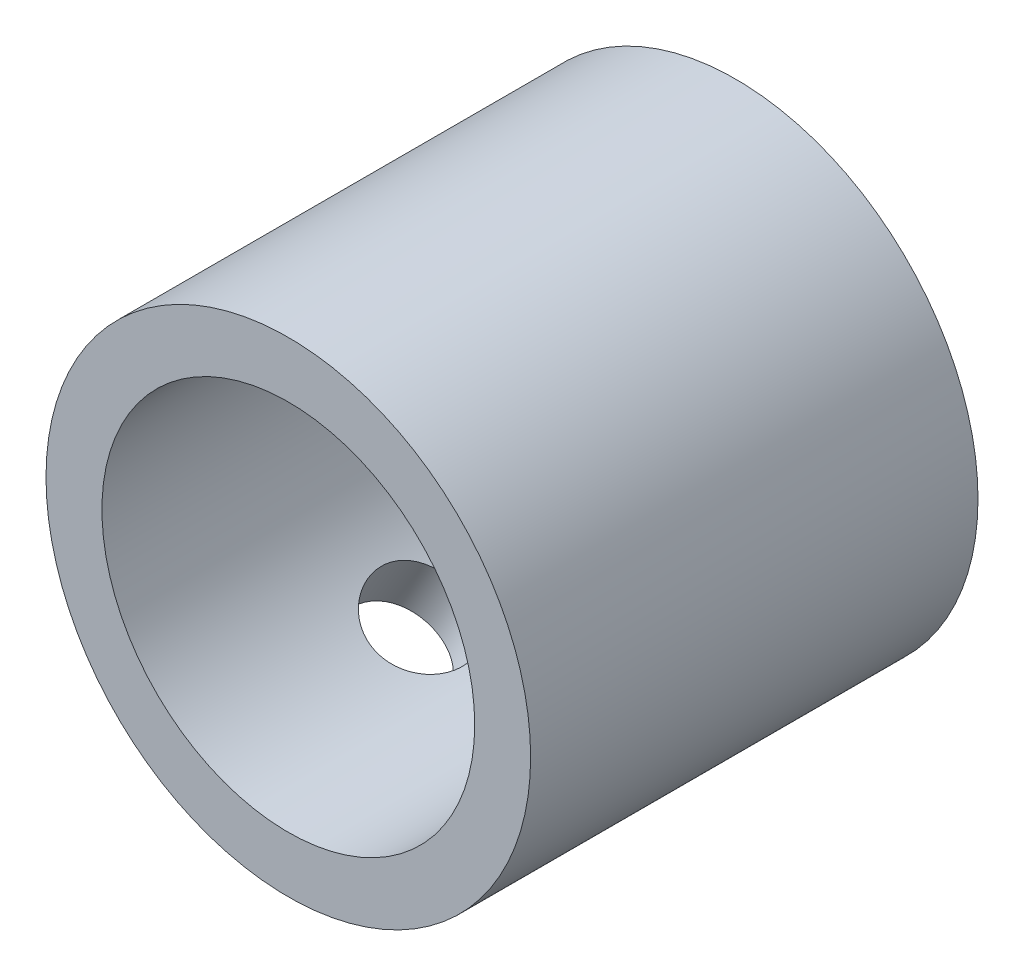
ISO-10303-21;
HEADER;
FILE_DESCRIPTION(('STEP AP214'),'2;1');
FILE_NAME('part.step','',(''),(''),'','','');
FILE_SCHEMA(('AUTOMOTIVE_DESIGN { 1 0 10303 214 1 1 1 1 }'));
ENDSEC;
DATA;
#1=APPLICATION_CONTEXT('core data for automotive mechanical design processes');
#2=APPLICATION_PROTOCOL_DEFINITION('international standard','automotive_design',2000,#1);
#3=PRODUCT_CONTEXT('',#1,'mechanical');
#4=PRODUCT('Part','Part','',(#3));
#5=PRODUCT_RELATED_PRODUCT_CATEGORY('part','',(#4));
#6=PRODUCT_DEFINITION_FORMATION('','',#4);
#7=PRODUCT_DEFINITION_CONTEXT('part definition',#1,'design');
#8=PRODUCT_DEFINITION('design','',#6,#7);
#9=PRODUCT_DEFINITION_SHAPE('','',#8);
#10=(LENGTH_UNIT() NAMED_UNIT(*) SI_UNIT(.MILLI.,.METRE.));
#11=(NAMED_UNIT(*) PLANE_ANGLE_UNIT() SI_UNIT($,.RADIAN.));
#12=(NAMED_UNIT(*) SI_UNIT($,.STERADIAN.) SOLID_ANGLE_UNIT());
#13=UNCERTAINTY_MEASURE_WITH_UNIT(LENGTH_MEASURE(1.E-05),#10,'distance_accuracy_value','');
#14=(GEOMETRIC_REPRESENTATION_CONTEXT(3) GLOBAL_UNCERTAINTY_ASSIGNED_CONTEXT((#13)) GLOBAL_UNIT_ASSIGNED_CONTEXT((#10,
#11,#12)) REPRESENTATION_CONTEXT('',''));
#15=CARTESIAN_POINT('',(0.,0.,0.));
#16=DIRECTION('',(0.,0.,1.));
#17=DIRECTION('',(1.,0.,0.));
#18=AXIS2_PLACEMENT_3D('',#15,#16,#17);
#19=CARTESIAN_POINT('',(0.,0.,6.));
#20=DIRECTION('',(0.,0.,1.));
#21=DIRECTION('',(1.,0.,0.));
#22=AXIS2_PLACEMENT_3D('',#19,#20,#21);
#23=PLANE('',#22);
#24=CARTESIAN_POINT('',(0.,0.,6.));
#25=DIRECTION('',(0.,0.,1.));
#26=DIRECTION('',(1.,0.,0.));
#27=AXIS2_PLACEMENT_3D('',#24,#25,#26);
#28=CIRCLE('',#27,6.5);
#29=CARTESIAN_POINT('',(6.5,0.,6.));
#30=VERTEX_POINT('',#29);
#31=EDGE_CURVE('E10',#30,#30,#28,.T.);
#32=ORIENTED_EDGE('',*,*,#31,.T.);
#33=EDGE_LOOP('',(#32));
#34=FACE_BOUND('',#33,.T.);
#35=CARTESIAN_POINT('',(0.,0.,6.));
#36=DIRECTION('',(0.,0.,1.));
#37=DIRECTION('',(1.,0.,0.));
#38=AXIS2_PLACEMENT_3D('',#35,#36,#37);
#39=CIRCLE('',#38,5.);
#40=CARTESIAN_POINT('',(5.,0.,6.));
#41=VERTEX_POINT('',#40);
#42=EDGE_CURVE('E58',#41,#41,#39,.T.);
#43=ORIENTED_EDGE('',*,*,#42,.F.);
#44=EDGE_LOOP('',(#43));
#45=FACE_BOUND('',#44,.T.);
#46=ADVANCED_FACE('F41',(#34,#45),#23,.T.);
#47=CARTESIAN_POINT('',(0.,0.,-6.));
#48=DIRECTION('',(0.,0.,1.));
#49=DIRECTION('',(1.,0.,0.));
#50=AXIS2_PLACEMENT_3D('',#47,#48,#49);
#51=PLANE('',#50);
#52=CARTESIAN_POINT('',(0.,0.,-6.));
#53=DIRECTION('',(0.,0.,1.));
#54=DIRECTION('',(1.,0.,0.));
#55=AXIS2_PLACEMENT_3D('',#52,#53,#54);
#56=CIRCLE('',#55,6.5);
#57=CARTESIAN_POINT('',(6.5,0.,-6.));
#58=VERTEX_POINT('',#57);
#59=EDGE_CURVE('E54',#58,#58,#56,.T.);
#60=ORIENTED_EDGE('',*,*,#59,.F.);
#61=EDGE_LOOP('',(#60));
#62=FACE_BOUND('',#61,.T.);
#63=CARTESIAN_POINT('',(0.,0.,-6.));
#64=DIRECTION('',(0.,0.,1.));
#65=DIRECTION('',(1.,0.,0.));
#66=AXIS2_PLACEMENT_3D('',#63,#64,#65);
#67=CIRCLE('',#66,5.);
#68=CARTESIAN_POINT('',(5.,0.,-6.));
#69=VERTEX_POINT('',#68);
#70=EDGE_CURVE('E65',#69,#69,#67,.T.);
#71=ORIENTED_EDGE('',*,*,#70,.T.);
#72=EDGE_LOOP('',(#71));
#73=FACE_BOUND('',#72,.T.);
#74=ADVANCED_FACE('F81',(#62,#73),#51,.F.);
#75=CARTESIAN_POINT('',(0.,0.,6.));
#76=DIRECTION('',(0.,0.,-1.));
#77=DIRECTION('',(-1.,0.,0.));
#78=AXIS2_PLACEMENT_3D('',#75,#76,#77);
#79=CYLINDRICAL_SURFACE('',#78,6.5);
#80=CARTESIAN_POINT('',(-4.27186946027382,-4.89909494849608,0.));
#81=CARTESIAN_POINT('',(-4.27186786234575,-4.89909744309064,0.0695129298701196));
#82=CARTESIAN_POINT('',(-4.26740512682392,-4.9029987715289,0.139059615060494));
#83=CARTESIAN_POINT('',(-4.24963701126369,-4.91840608002643,0.276189529414037));
#84=CARTESIAN_POINT('',(-4.23632429076359,-4.92991837282025,0.343771080023577));
#85=CARTESIAN_POINT('',(-4.2011402497674,-4.95993461568795,0.474966822381257));
#86=CARTESIAN_POINT('',(-4.17927710502217,-4.97843188628066,0.538584736914953));
#87=CARTESIAN_POINT('',(-4.12742162531229,-5.02150592376772,0.660186274966827));
#88=CARTESIAN_POINT('',(-4.09742985625947,-5.04608226742886,0.718170290333359));
#89=CARTESIAN_POINT('',(-4.02948728504461,-5.10050424792605,0.827620606218869));
#90=CARTESIAN_POINT('',(-3.99144724915814,-5.13040831263604,0.87900247475433));
#91=CARTESIAN_POINT('',(-3.90837101927236,-5.19397405762879,0.973053765073602));
#92=CARTESIAN_POINT('',(-3.86333435476041,-5.2276359905796,1.01572260047221));
#93=CARTESIAN_POINT('',(-3.76681408584738,-5.29761150827754,1.09146170512889));
#94=CARTESIAN_POINT('',(-3.71528160693785,-5.33394421877233,1.12445212935253));
#95=CARTESIAN_POINT('',(-3.60725951597228,-5.40758227913953,1.17938321266358));
#96=CARTESIAN_POINT('',(-3.55077033320674,-5.44488754458453,1.20132482755992));
#97=CARTESIAN_POINT('',(-3.43500415770324,-5.51864088017889,1.23327370175281));
#98=CARTESIAN_POINT('',(-3.37576961815057,-5.55509385515905,1.24342338756003));
#99=CARTESIAN_POINT('',(-3.25552415623739,-5.62640617292999,1.25194429161107));
#100=CARTESIAN_POINT('',(-3.19451339314365,-5.66126565788655,1.250316562668));
#101=CARTESIAN_POINT('',(-3.07331712468637,-5.72795298801813,1.23543761869705));
#102=CARTESIAN_POINT('',(-3.01313133400898,-5.75981471647099,1.22233978343455));
#103=CARTESIAN_POINT('',(-2.89456598347948,-5.82030239890072,1.18513527284376));
#104=CARTESIAN_POINT('',(-2.83618649203098,-5.84892823044454,1.16102818114417));
#105=CARTESIAN_POINT('',(-2.72266845744448,-5.90263046770287,1.10234485892795));
#106=CARTESIAN_POINT('',(-2.6675510381155,-5.92768496499254,1.06770777735751));
#107=CARTESIAN_POINT('',(-2.56263799935393,-5.97379068446724,0.988992603030234));
#108=CARTESIAN_POINT('',(-2.51284294893597,-5.99484147880341,0.944913502337156));
#109=CARTESIAN_POINT('',(-2.41941143172447,-6.03316199360017,0.847721745415709));
#110=CARTESIAN_POINT('',(-2.37588722108935,-6.05036526984383,0.794474882882507));
#111=CARTESIAN_POINT('',(-2.29746429023929,-6.08057804280119,0.680904912663811));
#112=CARTESIAN_POINT('',(-2.26256570956574,-6.09358747166985,0.620581690523576));
#113=CARTESIAN_POINT('',(-2.20261103421554,-6.11551555309188,0.494392991364382));
#114=CARTESIAN_POINT('',(-2.17757335231016,-6.12442655801484,0.428517422438188));
#115=CARTESIAN_POINT('',(-2.13841741418685,-6.13820870990296,0.293196222810533));
#116=CARTESIAN_POINT('',(-2.12429785108229,-6.14308034038179,0.22375102045181));
#117=CARTESIAN_POINT('',(-2.10768918720838,-6.14879851101782,0.0844403376857302));
#118=CARTESIAN_POINT('',(-2.10501938345139,-6.14970759291174,0.0145989431580968));
#119=CARTESIAN_POINT('',(-2.11092425337292,-6.14768315740969,-0.124547681934842));
#120=CARTESIAN_POINT('',(-2.11949834037982,-6.14474984049826,-0.193852940284295));
#121=CARTESIAN_POINT('',(-2.14741728181424,-6.13504784314217,-0.329337471596228));
#122=CARTESIAN_POINT('',(-2.16666717084787,-6.12831296974614,-0.395538802083322));
#123=CARTESIAN_POINT('',(-2.2151321915888,-6.11096128785448,-0.523644423727256));
#124=CARTESIAN_POINT('',(-2.24434809074075,-6.1003441803982,-0.585548383517923));
#125=CARTESIAN_POINT('',(-2.31210058251383,-6.07499054024122,-0.704127121192505));
#126=CARTESIAN_POINT('',(-2.35074574895078,-6.06020568514199,-0.760729507218858));
#127=CARTESIAN_POINT('',(-2.43583031046005,-6.0265097342154,-0.866342559432979));
#128=CARTESIAN_POINT('',(-2.48227044442971,-6.007598247167,-0.915352505073588));
#129=CARTESIAN_POINT('',(-2.58212434836239,-5.96536737535446,-1.00509487601673));
#130=CARTESIAN_POINT('',(-2.63562725990506,-5.94198956750573,-1.04570076602869));
#131=CARTESIAN_POINT('',(-2.74733910975695,-5.89117032598614,-1.11658765304746));
#132=CARTESIAN_POINT('',(-2.80554786032668,-5.86372905439092,-1.14686906169832));
#133=CARTESIAN_POINT('',(-2.92448389401298,-5.80532130404786,-1.19605986491778));
#134=CARTESIAN_POINT('',(-2.98519570282092,-5.7743748762347,-1.21503040532308));
#135=CARTESIAN_POINT('',(-3.107530616558,-5.70946968899642,-1.2412555973101));
#136=CARTESIAN_POINT('',(-3.16915361961867,-5.67551126421227,-1.24851154869842));
#137=CARTESIAN_POINT('',(-3.29045071205208,-5.6060450609572,-1.25105441574627));
#138=CARTESIAN_POINT('',(-3.35014020575901,-5.5705710202335,-1.24653211116508));
#139=CARTESIAN_POINT('',(-3.46691699931562,-5.49865348118977,-1.22606595991718));
#140=CARTESIAN_POINT('',(-3.52400432694987,-5.46220999322759,-1.21012223523286));
#141=CARTESIAN_POINT('',(-3.63398993373914,-5.38966165017567,-1.16734790380587));
#142=CARTESIAN_POINT('',(-3.68689616762111,-5.35355627317181,-1.140538595824));
#143=CARTESIAN_POINT('',(-3.787411628568,-5.28292448739852,-1.07681744274669));
#144=CARTESIAN_POINT('',(-3.83502047597361,-5.24839819190486,-1.03990487421402));
#145=CARTESIAN_POINT('',(-3.92460231013332,-5.18176264297562,-0.956373274834163));
#146=CARTESIAN_POINT('',(-3.96648001542141,-5.14969742901636,-0.909616913957637));
#147=CARTESIAN_POINT('',(-4.04290664697221,-5.08991805669507,-0.808008908722966));
#148=CARTESIAN_POINT('',(-4.07745384330518,-5.06220492578299,-0.753155358673284));
#149=CARTESIAN_POINT('',(-4.13883914765211,-5.01214516385493,-0.636265080511121));
#150=CARTESIAN_POINT('',(-4.16559824464007,-4.98985388761697,-0.574163120495855));
#151=CARTESIAN_POINT('',(-4.21039425164886,-4.9521152194259,-0.444979613077636));
#152=CARTESIAN_POINT('',(-4.22843927469328,-4.93666146269656,-0.377902764817236));
#153=CARTESIAN_POINT('',(-4.25188761832681,-4.9164640208084,-0.258870812634622));
#154=CARTESIAN_POINT('',(-4.25937182171337,-4.90996900874251,-0.207606006200682));
#155=CARTESIAN_POINT('',(-4.26936326759281,-4.90128360145746,-0.104233776828429));
#156=CARTESIAN_POINT('',(-4.27187065852865,-4.89909307784869,-0.0521263790687548));
#157=CARTESIAN_POINT('',(-4.27186946027382,-4.89909494849608,0.));
#158=B_SPLINE_CURVE_WITH_KNOTS('',3,(#80,#81,#82,#83,#84,#85,#86,#87,#88,#89,#90,#91,#92,#93,
#94,#95,#96,#97,#98,#99,#100,#101,#102,#103,#104,#105,#106,#107,#108,#109,#110,#111,#112,#113,
#114,#115,#116,#117,#118,#119,#120,#121,#122,#123,#124,#125,#126,#127,#128,#129,#130,#131,#132,
#133,#134,#135,#136,#137,#138,#139,#140,#141,#142,#143,#144,#145,#146,#147,#148,#149,#150,#151,
#152,#153,#154,#155,#156,#157),.UNSPECIFIED.,.T.,.F.,(4,2,2,2,2,2,2,2,2,2,2,2,2,2,2,2,2,2,2,2,2,
2,2,2,2,2,2,2,2,2,2,2,2,2,2,2,2,2,4),(0.,0.208347994425065,0.416869015339833,0.625191138043345,
0.833498761161484,1.04424985912792,1.25501513592546,1.46747321088402,1.67991290338878,
1.88975909537704,2.09958652891119,2.30665024511142,2.513721793133,2.72201348359888,
2.93032742030891,3.14200045966176,3.35367692313739,3.56574678669525,3.77779126179577,
3.98647658946278,4.19515102900509,4.40199833043662,4.60886156399135,4.81822954602393,
5.02761738559912,5.23995929713474,5.45229274146446,5.66346766485102,5.87461915545405,
6.08237184297279,6.29012231169614,6.49746750164925,6.70482754230237,6.91529891011172,
7.12581989203803,7.33840759539418,7.55079699078515,7.70703771468347,7.86327377833246),.UNSPECIFIED.);
#159=CARTESIAN_POINT('',(-4.27186946027382,-4.89909494849608,0.));
#160=VERTEX_POINT('',#159);
#161=EDGE_CURVE('E64',#160,#160,#158,.T.);
#162=ORIENTED_EDGE('',*,*,#161,.T.);
#163=EDGE_LOOP('',(#162));
#164=FACE_BOUND('',#163,.T.);
#165=ORIENTED_EDGE('',*,*,#31,.F.);
#166=EDGE_LOOP('',(#165));
#167=FACE_BOUND('',#166,.T.);
#168=ORIENTED_EDGE('',*,*,#59,.T.);
#169=EDGE_LOOP('',(#168));
#170=FACE_BOUND('',#169,.T.);
#171=ADVANCED_FACE('F43',(#164,#167,#170),#79,.T.);
#172=CARTESIAN_POINT('',(0.,0.,6.));
#173=DIRECTION('',(0.,0.,-1.));
#174=DIRECTION('',(-1.,0.,0.));
#175=AXIS2_PLACEMENT_3D('',#172,#173,#174);
#176=CYLINDRICAL_SURFACE('',#175,5.);
#177=CARTESIAN_POINT('',(-3.50314634611019,-3.5676274578121,0.));
#178=CARTESIAN_POINT('',(-3.50314530692425,-3.56762957929749,0.0690253754623047));
#179=CARTESIAN_POINT('',(-3.49892423832727,-3.57178830711976,0.138072449338997));
#180=CARTESIAN_POINT('',(-3.48211469932553,-3.58817645155009,0.274183789087018));
#181=CARTESIAN_POINT('',(-3.4695213591364,-3.60041056522746,0.341246877234163));
#182=CARTESIAN_POINT('',(-3.43621596285778,-3.63220943381692,0.47140176909352));
#183=CARTESIAN_POINT('',(-3.41551438698369,-3.65176472438374,0.534498577692835));
#184=CARTESIAN_POINT('',(-3.3663372339938,-3.69714598342672,0.65515542626996));
#185=CARTESIAN_POINT('',(-3.33786132682743,-3.72297221812367,0.712715231040114));
#186=CARTESIAN_POINT('',(-3.27293653008595,-3.78018393274517,0.821930822631102));
#187=CARTESIAN_POINT('',(-3.23634065155624,-3.81166955139191,0.873446800175022));
#188=CARTESIAN_POINT('',(-3.15611019546124,-3.87836114872433,0.967880697180171));
#189=CARTESIAN_POINT('',(-3.11247496053725,-3.91356747475613,1.01079781281087));
#190=CARTESIAN_POINT('',(-3.01828267576122,-3.9866737449444,1.08738773381564));
#191=CARTESIAN_POINT('',(-2.96763753888585,-4.02460441960382,1.12092319408073));
#192=CARTESIAN_POINT('',(-2.86098383937262,-4.10110618513409,1.17690482207654));
#193=CARTESIAN_POINT('',(-2.80497606952903,-4.13967718064719,1.19935262595776));
#194=CARTESIAN_POINT('',(-2.69017488385807,-4.2151608213337,1.23207391728929));
#195=CARTESIAN_POINT('',(-2.63146088555955,-4.25209123237034,1.24258482216329));
#196=CARTESIAN_POINT('',(-2.5118512047858,-4.32382508847932,1.25187918963778));
#197=CARTESIAN_POINT('',(-2.45095584619242,-4.3586288472513,1.2506643861048));
#198=CARTESIAN_POINT('',(-2.33017149665098,-4.42435604047927,1.23671257487493));
#199=CARTESIAN_POINT('',(-2.27029015822439,-4.45534844097088,1.22423183747307));
#200=CARTESIAN_POINT('',(-2.15197945040953,-4.51368336348766,1.18851436497575));
#201=CARTESIAN_POINT('',(-2.09355015848774,-4.54102569112072,1.1652770573113));
#202=CARTESIAN_POINT('',(-1.97940123884707,-4.59194027300241,1.10849871465647));
#203=CARTESIAN_POINT('',(-1.92371086439353,-4.61547623061808,1.07486647766913));
#204=CARTESIAN_POINT('',(-1.81732720973098,-4.65839211708266,0.998322160441871));
#205=CARTESIAN_POINT('',(-1.76663480113969,-4.67777132170704,0.95540846571969));
#206=CARTESIAN_POINT('',(-1.67057078117596,-4.71294855834917,0.860145629008812));
#207=CARTESIAN_POINT('',(-1.62538030748902,-4.7286354718809,0.807572553826114));
#208=CARTESIAN_POINT('',(-1.54356423087143,-4.75597261252283,0.695200013229874));
#209=CARTESIAN_POINT('',(-1.50693902826094,-4.76762265097145,0.6354002102545));
#210=CARTESIAN_POINT('',(-1.44351404356162,-4.7872099874444,0.509854982925517));
#211=CARTESIAN_POINT('',(-1.41676276509489,-4.79512900884234,0.444082134843403));
#212=CARTESIAN_POINT('',(-1.37449859215073,-4.8074154481278,0.308707265961774));
#213=CARTESIAN_POINT('',(-1.35898329274598,-4.81178362605555,0.239106068008432));
#214=CARTESIAN_POINT('',(-1.34016245479677,-4.8170591007694,0.10002024923844));
#215=CARTESIAN_POINT('',(-1.33654525354151,-4.81805475966854,0.0305811033351854));
#216=CARTESIAN_POINT('',(-1.34081081672342,-4.81686944841842,-0.107910968289079));
#217=CARTESIAN_POINT('',(-1.34869252254749,-4.81468877068928,-0.17696392897562));
#218=CARTESIAN_POINT('',(-1.37536917785952,-4.80713475915457,-0.311557132477353));
#219=CARTESIAN_POINT('',(-1.39398345997886,-4.80181424587578,-0.377136363285421));
#220=CARTESIAN_POINT('',(-1.44120205842815,-4.78785327084102,-0.504215728925841));
#221=CARTESIAN_POINT('',(-1.46980755816156,-4.7792124157971,-0.565715379527669));
#222=CARTESIAN_POINT('',(-1.5365620105616,-4.75817413920942,-0.684220638933674));
#223=CARTESIAN_POINT('',(-1.57488717068116,-4.74570634964378,-0.741114420021551));
#224=CARTESIAN_POINT('',(-1.65940153542675,-4.71681850185306,-0.847594181400676));
#225=CARTESIAN_POINT('',(-1.70559203232319,-4.70039779398201,-0.897178958325037));
#226=CARTESIAN_POINT('',(-1.80553460636586,-4.66293447551135,-0.988905521285478));
#227=CARTESIAN_POINT('',(-1.85944696550056,-4.64178649955572,-1.03083003127441));
#228=CARTESIAN_POINT('',(-1.97210990872577,-4.59505126675973,-1.10446793347562));
#229=CARTESIAN_POINT('',(-2.03086024025161,-4.5694642415813,-1.1361818583041));
#230=CARTESIAN_POINT('',(-2.15082351550622,-4.51423111129839,-1.18822301726397));
#231=CARTESIAN_POINT('',(-2.21201521203033,-4.48461618692146,-1.20863214218953));
#232=CARTESIAN_POINT('',(-2.33527183092635,-4.42168386144584,-1.23773016730421));
#233=CARTESIAN_POINT('',(-2.39733658243787,-4.38836717622902,-1.24642132936952));
#234=CARTESIAN_POINT('',(-2.51870701866275,-4.3198197095959,-1.25170948696942));
#235=CARTESIAN_POINT('',(-2.57804193009159,-4.28466503954648,-1.24862713636924));
#236=CARTESIAN_POINT('',(-2.69399792700384,-4.21272254401902,-1.23119021588209));
#237=CARTESIAN_POINT('',(-2.75061909314394,-4.17593476714211,-1.21683598123362));
#238=CARTESIAN_POINT('',(-2.85940490346236,-4.10220698309634,-1.17743472528634));
#239=CARTESIAN_POINT('',(-2.91159189787995,-4.06526886158141,-1.15244568335672));
#240=CARTESIAN_POINT('',(-3.01071379105532,-3.99241662055245,-1.09253677622584));
#241=CARTESIAN_POINT('',(-3.05764802670351,-3.95650263075056,-1.05761565916304));
#242=CARTESIAN_POINT('',(-3.14643775749693,-3.886285237778,-0.977855957503658));
#243=CARTESIAN_POINT('',(-3.18814464274632,-3.85204103236368,-0.932799821365777));
#244=CARTESIAN_POINT('',(-3.26442602458519,-3.78761418145349,-0.834471435032752));
#245=CARTESIAN_POINT('',(-3.29899871037243,-3.75743256779877,-0.781197104877617));
#246=CARTESIAN_POINT('',(-3.36102603824691,-3.70206279760751,-0.666748232248333));
#247=CARTESIAN_POINT('',(-3.38833585376269,-3.67697830320787,-0.605444845734215));
#248=CARTESIAN_POINT('',(-3.43449499033692,-3.63390258006515,-0.477430637596623));
#249=CARTESIAN_POINT('',(-3.45335046733067,-3.61590619135914,-0.410723792366572));
#250=CARTESIAN_POINT('',(-3.47954275932057,-3.59068852483803,-0.286778735216605));
#251=CARTESIAN_POINT('',(-3.48838299736091,-3.58207366120005,-0.230133544520174));
#252=CARTESIAN_POINT('',(-3.50018497542351,-3.57054248188956,-0.115663913750045));
#253=CARTESIAN_POINT('',(-3.50314721689245,-3.56762568012076,-0.057839574693673));
#254=CARTESIAN_POINT('',(-3.50314634611019,-3.5676274578121,0.));
#255=B_SPLINE_CURVE_WITH_KNOTS('',3,(#177,#178,#179,#180,#181,#182,#183,#184,#185,#186,#187,
#188,#189,#190,#191,#192,#193,#194,#195,#196,#197,#198,#199,#200,#201,#202,#203,#204,#205,#206,
#207,#208,#209,#210,#211,#212,#213,#214,#215,#216,#217,#218,#219,#220,#221,#222,#223,#224,#225,
#226,#227,#228,#229,#230,#231,#232,#233,#234,#235,#236,#237,#238,#239,#240,#241,#242,#243,#244,
#245,#246,#247,#248,#249,#250,#251,#252,#253,#254),.UNSPECIFIED.,.T.,.F.,(4,2,2,2,2,2,2,2,2,2,2,
2,2,2,2,2,2,2,2,2,2,2,2,2,2,2,2,2,2,2,2,2,2,2,2,2,2,2,4),(0.,0.206863720868068,
0.413847870714333,0.62056536358301,0.827291633777393,1.03811977096488,1.24896760739933,
1.4627574819896,1.67651579923546,1.88594375497673,2.0953407433301,2.30009131344473,
2.50485278362393,2.71146437127222,2.91811192734457,3.13035233285956,3.34260265599901,
3.55588216004201,3.76911600064774,3.97671787380858,4.18430063591901,4.38848702504603,
4.59269760710709,4.80091422929578,5.00916509442522,5.22262665482659,5.43607707859777,
5.64796036403464,5.85980274454519,6.06591723063728,6.2720255868849,6.47702438279855,
6.68204902869036,6.89198548291035,7.10197515782754,7.31588238642338,7.5296336068331,
7.70298913588665,7.8763298754976),.UNSPECIFIED.);
#256=CARTESIAN_POINT('',(-3.50314634611019,-3.5676274578121,0.));
#257=VERTEX_POINT('',#256);
#258=EDGE_CURVE('E46',#257,#257,#255,.T.);
#259=ORIENTED_EDGE('',*,*,#258,.F.);
#260=EDGE_LOOP('',(#259));
#261=FACE_BOUND('',#260,.T.);
#262=ORIENTED_EDGE('',*,*,#42,.T.);
#263=EDGE_LOOP('',(#262));
#264=FACE_BOUND('',#263,.T.);
#265=ORIENTED_EDGE('',*,*,#70,.F.);
#266=EDGE_LOOP('',(#265));
#267=FACE_BOUND('',#266,.T.);
#268=ADVANCED_FACE('F74',(#261,#264,#267),#176,.F.);
#269=CARTESIAN_POINT('',(-1.27245857699328,-2.20396290587914,0.));
#270=DIRECTION('',(0.500000000000001,0.866025403784438,0.));
#271=DIRECTION('',(-0.866025403784438,0.500000000000001,0.));
#272=AXIS2_PLACEMENT_3D('',#269,#270,#271);
#273=CYLINDRICAL_SURFACE('',#272,1.25);
#274=ORIENTED_EDGE('',*,*,#258,.T.);
#275=EDGE_LOOP('',(#274));
#276=FACE_BOUND('',#275,.T.);
#277=ORIENTED_EDGE('',*,*,#161,.F.);
#278=EDGE_LOOP('',(#277));
#279=FACE_BOUND('',#278,.T.);
#280=ADVANCED_FACE('F75',(#276,#279),#273,.F.);
#281=CLOSED_SHELL('',(#46,#74,#171,#268,#280));
#282=MANIFOLD_SOLID_BREP('B2',#281);
#283=ADVANCED_BREP_SHAPE_REPRESENTATION('',(#18,#282),#14);
#284=SHAPE_DEFINITION_REPRESENTATION(#9,#283);
ENDSEC;
END-ISO-10303-21;
